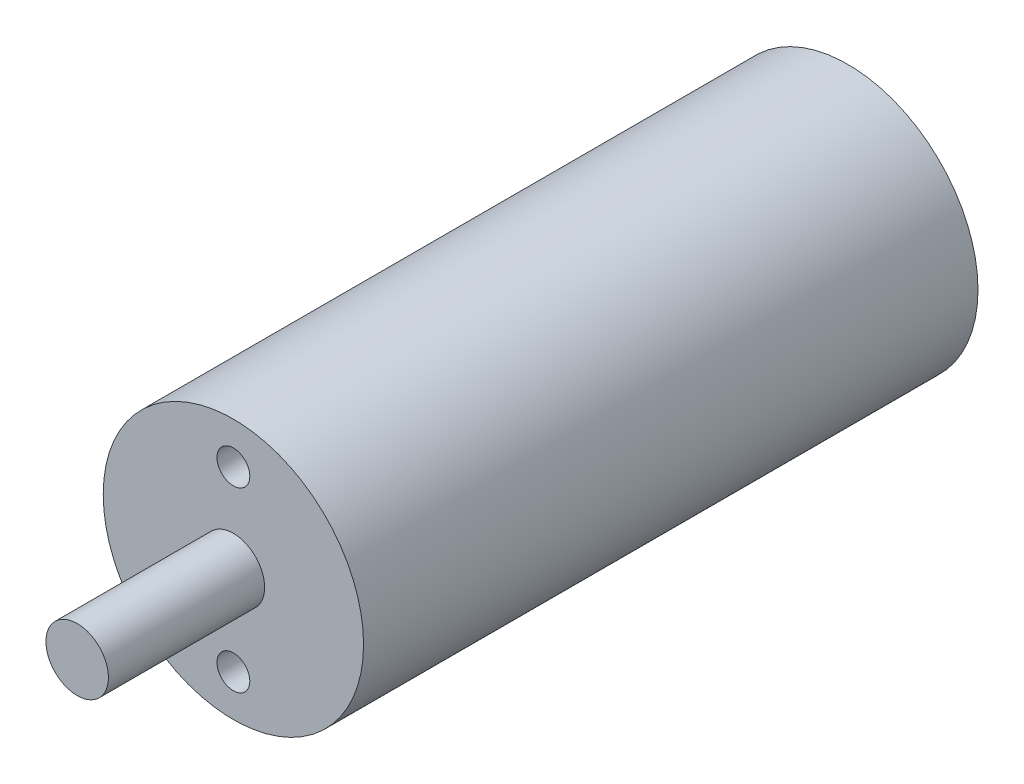
ISO-10303-21;
HEADER;
FILE_DESCRIPTION(('STEP AP214'),'2;1');
FILE_NAME('part.step','',(''),(''),'','','');
FILE_SCHEMA(('AUTOMOTIVE_DESIGN { 1 0 10303 214 1 1 1 1 }'));
ENDSEC;
DATA;
#1=APPLICATION_CONTEXT('core data for automotive mechanical design processes');
#2=APPLICATION_PROTOCOL_DEFINITION('international standard','automotive_design',2000,#1);
#3=PRODUCT_CONTEXT('',#1,'mechanical');
#4=PRODUCT('Part','Part','',(#3));
#5=PRODUCT_RELATED_PRODUCT_CATEGORY('part','',(#4));
#6=PRODUCT_DEFINITION_FORMATION('','',#4);
#7=PRODUCT_DEFINITION_CONTEXT('part definition',#1,'design');
#8=PRODUCT_DEFINITION('design','',#6,#7);
#9=PRODUCT_DEFINITION_SHAPE('','',#8);
#10=(LENGTH_UNIT() NAMED_UNIT(*) SI_UNIT(.MILLI.,.METRE.));
#11=(NAMED_UNIT(*) PLANE_ANGLE_UNIT() SI_UNIT($,.RADIAN.));
#12=(NAMED_UNIT(*) SI_UNIT($,.STERADIAN.) SOLID_ANGLE_UNIT());
#13=UNCERTAINTY_MEASURE_WITH_UNIT(LENGTH_MEASURE(1.E-05),#10,'distance_accuracy_value','');
#14=(GEOMETRIC_REPRESENTATION_CONTEXT(3) GLOBAL_UNCERTAINTY_ASSIGNED_CONTEXT((#13)) GLOBAL_UNIT_ASSIGNED_CONTEXT((#10,
#11,#12)) REPRESENTATION_CONTEXT('',''));
#15=CARTESIAN_POINT('',(0.,0.,0.));
#16=DIRECTION('',(0.,0.,1.));
#17=DIRECTION('',(1.,0.,0.));
#18=AXIS2_PLACEMENT_3D('',#15,#16,#17);
#19=CARTESIAN_POINT('',(-10.3914378040036,5.87591140075598,59.));
#20=DIRECTION('',(0.,0.,-1.));
#21=DIRECTION('',(-1.,0.,0.));
#22=AXIS2_PLACEMENT_3D('',#19,#20,#21);
#23=CYLINDRICAL_SURFACE('',#22,12.5);
#24=CARTESIAN_POINT('',(-10.3914378040036,5.87591140075598,59.));
#25=DIRECTION('',(0.,0.,1.));
#26=DIRECTION('',(1.,0.,0.));
#27=AXIS2_PLACEMENT_3D('',#24,#25,#26);
#28=CIRCLE('',#27,12.5);
#29=CARTESIAN_POINT('',(2.10856219599638,5.87591140075598,59.));
#30=VERTEX_POINT('',#29);
#31=EDGE_CURVE('E10',#30,#30,#28,.T.);
#32=ORIENTED_EDGE('',*,*,#31,.F.);
#33=EDGE_LOOP('',(#32));
#34=FACE_BOUND('',#33,.T.);
#35=CARTESIAN_POINT('',(-10.3914378040036,5.87591140075598,0.));
#36=DIRECTION('',(0.,0.,1.));
#37=DIRECTION('',(1.,0.,0.));
#38=AXIS2_PLACEMENT_3D('',#35,#36,#37);
#39=CIRCLE('',#38,12.5);
#40=CARTESIAN_POINT('',(2.10856219599638,5.87591140075598,0.));
#41=VERTEX_POINT('',#40);
#42=EDGE_CURVE('E38',#41,#41,#39,.T.);
#43=ORIENTED_EDGE('',*,*,#42,.T.);
#44=EDGE_LOOP('',(#43));
#45=FACE_BOUND('',#44,.T.);
#46=ADVANCED_FACE('F35',(#34,#45),#23,.T.);
#47=CARTESIAN_POINT('',(-10.3914378040036,5.87591140075598,59.));
#48=DIRECTION('',(0.,0.,1.));
#49=DIRECTION('',(1.,0.,0.));
#50=AXIS2_PLACEMENT_3D('',#47,#48,#49);
#51=PLANE('',#50);
#52=CARTESIAN_POINT('',(-10.3914378040036,5.87591140075598,59.));
#53=DIRECTION('',(0.,0.,1.));
#54=DIRECTION('',(1.,0.,0.));
#55=AXIS2_PLACEMENT_3D('',#52,#53,#54);
#56=CIRCLE('',#55,3.);
#57=CARTESIAN_POINT('',(-7.39143780400362,5.87591140075598,59.));
#58=VERTEX_POINT('',#57);
#59=EDGE_CURVE('E59',#58,#58,#56,.T.);
#60=ORIENTED_EDGE('',*,*,#59,.F.);
#61=EDGE_LOOP('',(#60));
#62=FACE_BOUND('',#61,.T.);
#63=CARTESIAN_POINT('',(-10.3914378040036,-2.64578859924402,59.));
#64=DIRECTION('',(0.,0.,1.));
#65=DIRECTION('',(-1.,0.,0.));
#66=AXIS2_PLACEMENT_3D('',#63,#64,#65);
#67=CIRCLE('',#66,1.575);
#68=CARTESIAN_POINT('',(-11.9664378040036,-2.64578859924402,59.));
#69=VERTEX_POINT('',#68);
#70=EDGE_CURVE('E53',#69,#69,#67,.T.);
#71=ORIENTED_EDGE('',*,*,#70,.F.);
#72=EDGE_LOOP('',(#71));
#73=FACE_BOUND('',#72,.T.);
#74=CARTESIAN_POINT('',(-10.3914378040036,14.397611400756,59.));
#75=DIRECTION('',(0.,0.,1.));
#76=DIRECTION('',(1.,0.,0.));
#77=AXIS2_PLACEMENT_3D('',#74,#75,#76);
#78=CIRCLE('',#77,1.575);
#79=CARTESIAN_POINT('',(-8.81643780400362,14.397611400756,59.));
#80=VERTEX_POINT('',#79);
#81=EDGE_CURVE('E47',#80,#80,#78,.T.);
#82=ORIENTED_EDGE('',*,*,#81,.F.);
#83=EDGE_LOOP('',(#82));
#84=FACE_BOUND('',#83,.T.);
#85=ORIENTED_EDGE('',*,*,#31,.T.);
#86=EDGE_LOOP('',(#85));
#87=FACE_BOUND('',#86,.T.);
#88=ADVANCED_FACE('F74',(#62,#73,#84,#87),#51,.T.);
#89=CARTESIAN_POINT('',(-10.3914378040036,5.87591140075598,0.));
#90=DIRECTION('',(0.,0.,1.));
#91=DIRECTION('',(1.,0.,0.));
#92=AXIS2_PLACEMENT_3D('',#89,#90,#91);
#93=PLANE('',#92);
#94=ORIENTED_EDGE('',*,*,#42,.F.);
#95=EDGE_LOOP('',(#94));
#96=FACE_BOUND('',#95,.T.);
#97=ADVANCED_FACE('F77',(#96),#93,.F.);
#98=CARTESIAN_POINT('',(-10.3914378040036,14.397611400756,46.3));
#99=DIRECTION('',(0.,0.,1.));
#100=DIRECTION('',(1.,0.,0.));
#101=AXIS2_PLACEMENT_3D('',#98,#99,#100);
#102=CYLINDRICAL_SURFACE('',#101,1.575);
#103=CARTESIAN_POINT('',(-10.3914378040036,14.397611400756,46.3));
#104=DIRECTION('',(0.,0.,1.));
#105=DIRECTION('',(1.,0.,0.));
#106=AXIS2_PLACEMENT_3D('',#103,#104,#105);
#107=CIRCLE('',#106,1.575);
#108=CARTESIAN_POINT('',(-8.81643780400362,14.397611400756,46.3));
#109=VERTEX_POINT('',#108);
#110=EDGE_CURVE('E45',#109,#109,#107,.T.);
#111=ORIENTED_EDGE('',*,*,#110,.F.);
#112=EDGE_LOOP('',(#111));
#113=FACE_BOUND('',#112,.T.);
#114=ORIENTED_EDGE('',*,*,#81,.T.);
#115=EDGE_LOOP('',(#114));
#116=FACE_BOUND('',#115,.T.);
#117=ADVANCED_FACE('F83',(#113,#116),#102,.F.);
#118=CARTESIAN_POINT('',(-10.3914378040036,14.397611400756,46.3));
#119=DIRECTION('',(0.,0.,1.));
#120=DIRECTION('',(1.,0.,0.));
#121=AXIS2_PLACEMENT_3D('',#118,#119,#120);
#122=PLANE('',#121);
#123=ORIENTED_EDGE('',*,*,#110,.T.);
#124=EDGE_LOOP('',(#123));
#125=FACE_BOUND('',#124,.T.);
#126=ADVANCED_FACE('F85',(#125),#122,.T.);
#127=CARTESIAN_POINT('',(-10.3914378040036,-2.64578859924402,46.3));
#128=DIRECTION('',(0.,0.,1.));
#129=DIRECTION('',(1.,0.,0.));
#130=AXIS2_PLACEMENT_3D('',#127,#128,#129);
#131=CYLINDRICAL_SURFACE('',#130,1.575);
#132=CARTESIAN_POINT('',(-10.3914378040036,-2.64578859924402,46.3));
#133=DIRECTION('',(0.,0.,1.));
#134=DIRECTION('',(-1.,0.,0.));
#135=AXIS2_PLACEMENT_3D('',#132,#133,#134);
#136=CIRCLE('',#135,1.575);
#137=CARTESIAN_POINT('',(-11.9664378040036,-2.64578859924402,46.3));
#138=VERTEX_POINT('',#137);
#139=EDGE_CURVE('E50',#138,#138,#136,.T.);
#140=ORIENTED_EDGE('',*,*,#139,.F.);
#141=EDGE_LOOP('',(#140));
#142=FACE_BOUND('',#141,.T.);
#143=ORIENTED_EDGE('',*,*,#70,.T.);
#144=EDGE_LOOP('',(#143));
#145=FACE_BOUND('',#144,.T.);
#146=ADVANCED_FACE('F92',(#142,#145),#131,.F.);
#147=CARTESIAN_POINT('',(-10.3914378040036,-2.64578859924402,46.3));
#148=DIRECTION('',(0.,0.,-1.));
#149=DIRECTION('',(-1.,0.,0.));
#150=AXIS2_PLACEMENT_3D('',#147,#148,#149);
#151=PLANE('',#150);
#152=ORIENTED_EDGE('',*,*,#139,.T.);
#153=EDGE_LOOP('',(#152));
#154=FACE_BOUND('',#153,.T.);
#155=ADVANCED_FACE('F70',(#154),#151,.F.);
#156=CARTESIAN_POINT('',(-10.3914378040036,5.87591140075598,74.));
#157=DIRECTION('',(0.,0.,-1.));
#158=DIRECTION('',(-1.,0.,0.));
#159=AXIS2_PLACEMENT_3D('',#156,#157,#158);
#160=CYLINDRICAL_SURFACE('',#159,3.);
#161=CARTESIAN_POINT('',(-10.3914378040036,5.87591140075598,74.));
#162=DIRECTION('',(0.,0.,1.));
#163=DIRECTION('',(1.,0.,0.));
#164=AXIS2_PLACEMENT_3D('',#161,#162,#163);
#165=CIRCLE('',#164,3.);
#166=CARTESIAN_POINT('',(-7.39143780400362,5.87591140075598,74.));
#167=VERTEX_POINT('',#166);
#168=EDGE_CURVE('E56',#167,#167,#165,.T.);
#169=ORIENTED_EDGE('',*,*,#168,.F.);
#170=EDGE_LOOP('',(#169));
#171=FACE_BOUND('',#170,.T.);
#172=ORIENTED_EDGE('',*,*,#59,.T.);
#173=EDGE_LOOP('',(#172));
#174=FACE_BOUND('',#173,.T.);
#175=ADVANCED_FACE('F67',(#171,#174),#160,.T.);
#176=CARTESIAN_POINT('',(-10.3914378040036,5.87591140075598,74.));
#177=DIRECTION('',(0.,0.,1.));
#178=DIRECTION('',(1.,0.,0.));
#179=AXIS2_PLACEMENT_3D('',#176,#177,#178);
#180=PLANE('',#179);
#181=ORIENTED_EDGE('',*,*,#168,.T.);
#182=EDGE_LOOP('',(#181));
#183=FACE_BOUND('',#182,.T.);
#184=ADVANCED_FACE('F65',(#183),#180,.T.);
#185=CLOSED_SHELL('',(#46,#88,#97,#117,#126,#146,#155,#175,#184));
#186=MANIFOLD_SOLID_BREP('B2',#185);
#187=ADVANCED_BREP_SHAPE_REPRESENTATION('',(#18,#186),#14);
#188=SHAPE_DEFINITION_REPRESENTATION(#9,#187);
ENDSEC;
END-ISO-10303-21;
